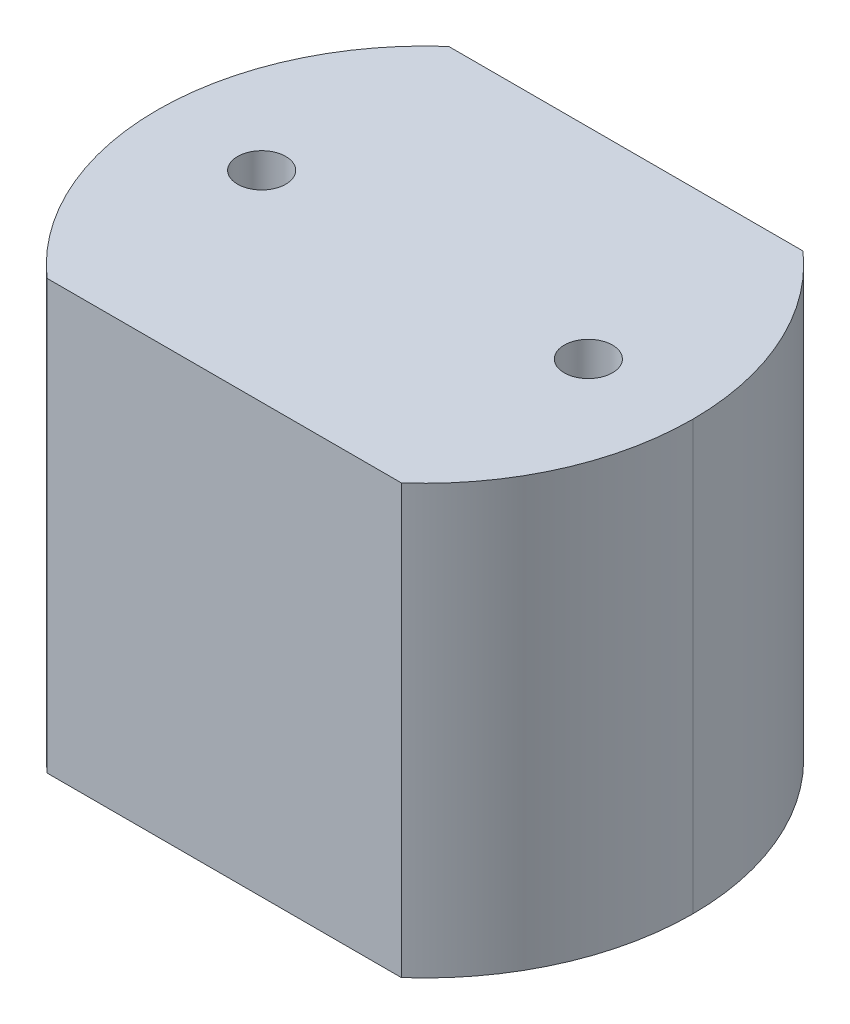
ISO-10303-21;
HEADER;
FILE_DESCRIPTION(('STEP AP214'),'2;1');
FILE_NAME('part.step','',(''),(''),'','','');
FILE_SCHEMA(('AUTOMOTIVE_DESIGN { 1 0 10303 214 1 1 1 1 }'));
ENDSEC;
DATA;
#1=APPLICATION_CONTEXT('core data for automotive mechanical design processes');
#2=APPLICATION_PROTOCOL_DEFINITION('international standard','automotive_design',2000,#1);
#3=PRODUCT_CONTEXT('',#1,'mechanical');
#4=PRODUCT('Part','Part','',(#3));
#5=PRODUCT_RELATED_PRODUCT_CATEGORY('part','',(#4));
#6=PRODUCT_DEFINITION_FORMATION('','',#4);
#7=PRODUCT_DEFINITION_CONTEXT('part definition',#1,'design');
#8=PRODUCT_DEFINITION('design','',#6,#7);
#9=PRODUCT_DEFINITION_SHAPE('','',#8);
#10=(LENGTH_UNIT() NAMED_UNIT(*) SI_UNIT(.MILLI.,.METRE.));
#11=(NAMED_UNIT(*) PLANE_ANGLE_UNIT() SI_UNIT($,.RADIAN.));
#12=(NAMED_UNIT(*) SI_UNIT($,.STERADIAN.) SOLID_ANGLE_UNIT());
#13=UNCERTAINTY_MEASURE_WITH_UNIT(LENGTH_MEASURE(1.E-05),#10,'distance_accuracy_value','');
#14=(GEOMETRIC_REPRESENTATION_CONTEXT(3) GLOBAL_UNCERTAINTY_ASSIGNED_CONTEXT((#13)) GLOBAL_UNIT_ASSIGNED_CONTEXT((#10,
#11,#12)) REPRESENTATION_CONTEXT('',''));
#15=CARTESIAN_POINT('',(0.,0.,0.));
#16=DIRECTION('',(0.,0.,1.));
#17=DIRECTION('',(1.,0.,0.));
#18=AXIS2_PLACEMENT_3D('',#15,#16,#17);
#19=CARTESIAN_POINT('',(0.,20.32,0.));
#20=DIRECTION('',(0.,-1.,0.));
#21=DIRECTION('',(0.,0.,-1.));
#22=AXIS2_PLACEMENT_3D('',#19,#20,#21);
#23=PLANE('',#22);
#24=CARTESIAN_POINT('',(7.747,20.32,0.));
#25=DIRECTION('',(0.,1.,0.));
#26=DIRECTION('',(0.,0.,-1.));
#27=AXIS2_PLACEMENT_3D('',#24,#25,#26);
#28=CIRCLE('',#27,1.143);
#29=CARTESIAN_POINT('',(7.747,20.32,-1.143));
#30=VERTEX_POINT('',#29);
#31=EDGE_CURVE('E129',#30,#30,#28,.T.);
#32=ORIENTED_EDGE('',*,*,#31,.F.);
#33=EDGE_LOOP('',(#32));
#34=FACE_BOUND('',#33,.T.);
#35=CARTESIAN_POINT('',(-7.747,20.32,0.));
#36=DIRECTION('',(0.,1.,0.));
#37=DIRECTION('',(0.,0.,1.));
#38=AXIS2_PLACEMENT_3D('',#35,#36,#37);
#39=CIRCLE('',#38,1.143);
#40=CARTESIAN_POINT('',(-7.747,20.32,1.143));
#41=VERTEX_POINT('',#40);
#42=EDGE_CURVE('E143',#41,#41,#39,.T.);
#43=ORIENTED_EDGE('',*,*,#42,.F.);
#44=EDGE_LOOP('',(#43));
#45=FACE_BOUND('',#44,.T.);
#46=CARTESIAN_POINT('',(0.,20.32,0.));
#47=DIRECTION('',(0.,-1.,0.));
#48=DIRECTION('',(0.,0.,-1.));
#49=AXIS2_PLACEMENT_3D('',#46,#47,#48);
#50=CIRCLE('',#49,12.7);
#51=CARTESIAN_POINT('',(-12.7,20.32,0.));
#52=VERTEX_POINT('',#51);
#53=CARTESIAN_POINT('',(-8.40026041263007,20.32,9.525));
#54=VERTEX_POINT('',#53);
#55=EDGE_CURVE('E116',#52,#54,#50,.F.);
#56=ORIENTED_EDGE('',*,*,#55,.T.);
#57=DIRECTION('',(-1.,0.,0.));
#58=VECTOR('',#57,1.);
#59=CARTESIAN_POINT('',(8.40026041263007,20.32,9.525));
#60=LINE('',#59,#58);
#61=CARTESIAN_POINT('',(8.40026041263007,20.32,9.525));
#62=VERTEX_POINT('',#61);
#63=EDGE_CURVE('E50',#62,#54,#60,.T.);
#64=ORIENTED_EDGE('',*,*,#63,.F.);
#65=CARTESIAN_POINT('',(0.,20.32,0.));
#66=DIRECTION('',(0.,-1.,0.));
#67=DIRECTION('',(0.,0.,-1.));
#68=AXIS2_PLACEMENT_3D('',#65,#66,#67);
#69=CIRCLE('',#68,12.7);
#70=CARTESIAN_POINT('',(12.7,20.32,0.));
#71=VERTEX_POINT('',#70);
#72=EDGE_CURVE('E100',#62,#71,#69,.F.);
#73=ORIENTED_EDGE('',*,*,#72,.T.);
#74=CARTESIAN_POINT('',(0.,20.32,0.));
#75=DIRECTION('',(0.,-1.,0.));
#76=DIRECTION('',(0.,0.,-1.));
#77=AXIS2_PLACEMENT_3D('',#74,#75,#76);
#78=CIRCLE('',#77,12.7);
#79=CARTESIAN_POINT('',(8.40026041263007,20.32,-9.525));
#80=VERTEX_POINT('',#79);
#81=EDGE_CURVE('E42',#71,#80,#78,.F.);
#82=ORIENTED_EDGE('',*,*,#81,.T.);
#83=DIRECTION('',(1.,0.,0.));
#84=VECTOR('',#83,1.);
#85=CARTESIAN_POINT('',(8.40026041263007,20.32,-9.525));
#86=LINE('',#85,#84);
#87=CARTESIAN_POINT('',(-8.40026041263007,20.32,-9.525));
#88=VERTEX_POINT('',#87);
#89=EDGE_CURVE('E137',#88,#80,#86,.T.);
#90=ORIENTED_EDGE('',*,*,#89,.F.);
#91=CARTESIAN_POINT('',(0.,20.32,0.));
#92=DIRECTION('',(0.,-1.,0.));
#93=DIRECTION('',(0.,0.,-1.));
#94=AXIS2_PLACEMENT_3D('',#91,#92,#93);
#95=CIRCLE('',#94,12.7);
#96=EDGE_CURVE('E11',#88,#52,#95,.F.);
#97=ORIENTED_EDGE('',*,*,#96,.T.);
#98=EDGE_LOOP('',(#56,#64,#73,#82,#90,#97));
#99=FACE_BOUND('',#98,.T.);
#100=ADVANCED_FACE('F33',(#34,#45,#99),#23,.F.);
#101=CARTESIAN_POINT('',(0.,0.,0.));
#102=DIRECTION('',(0.,-1.,0.));
#103=DIRECTION('',(0.,0.,-1.));
#104=AXIS2_PLACEMENT_3D('',#101,#102,#103);
#105=PLANE('',#104);
#106=DIRECTION('',(-1.,0.,0.));
#107=VECTOR('',#106,1.);
#108=CARTESIAN_POINT('',(8.40026041263007,0.,9.525));
#109=LINE('',#108,#107);
#110=CARTESIAN_POINT('',(8.40026041263007,0.,9.525));
#111=VERTEX_POINT('',#110);
#112=CARTESIAN_POINT('',(-8.40026041263007,0.,9.525));
#113=VERTEX_POINT('',#112);
#114=EDGE_CURVE('E85',#111,#113,#109,.T.);
#115=ORIENTED_EDGE('',*,*,#114,.T.);
#116=CARTESIAN_POINT('',(0.,0.,0.));
#117=DIRECTION('',(0.,-1.,0.));
#118=DIRECTION('',(0.,0.,-1.));
#119=AXIS2_PLACEMENT_3D('',#116,#117,#118);
#120=CIRCLE('',#119,12.7);
#121=CARTESIAN_POINT('',(-12.7,0.,0.));
#122=VERTEX_POINT('',#121);
#123=EDGE_CURVE('E106',#113,#122,#120,.T.);
#124=ORIENTED_EDGE('',*,*,#123,.T.);
#125=CARTESIAN_POINT('',(0.,0.,0.));
#126=DIRECTION('',(0.,-1.,0.));
#127=DIRECTION('',(0.,0.,-1.));
#128=AXIS2_PLACEMENT_3D('',#125,#126,#127);
#129=CIRCLE('',#128,12.7);
#130=CARTESIAN_POINT('',(-8.40026041263007,0.,-9.525));
#131=VERTEX_POINT('',#130);
#132=EDGE_CURVE('E108',#122,#131,#129,.T.);
#133=ORIENTED_EDGE('',*,*,#132,.T.);
#134=DIRECTION('',(1.,0.,0.));
#135=VECTOR('',#134,1.);
#136=CARTESIAN_POINT('',(8.40026041263007,0.,-9.525));
#137=LINE('',#136,#135);
#138=CARTESIAN_POINT('',(8.40026041263007,0.,-9.525));
#139=VERTEX_POINT('',#138);
#140=EDGE_CURVE('E58',#131,#139,#137,.T.);
#141=ORIENTED_EDGE('',*,*,#140,.T.);
#142=CARTESIAN_POINT('',(0.,0.,0.));
#143=DIRECTION('',(0.,-1.,0.));
#144=DIRECTION('',(0.,0.,-1.));
#145=AXIS2_PLACEMENT_3D('',#142,#143,#144);
#146=CIRCLE('',#145,12.7);
#147=CARTESIAN_POINT('',(12.7,0.,0.));
#148=VERTEX_POINT('',#147);
#149=EDGE_CURVE('E105',#139,#148,#146,.T.);
#150=ORIENTED_EDGE('',*,*,#149,.T.);
#151=CARTESIAN_POINT('',(0.,0.,0.));
#152=DIRECTION('',(0.,-1.,0.));
#153=DIRECTION('',(0.,0.,-1.));
#154=AXIS2_PLACEMENT_3D('',#151,#152,#153);
#155=CIRCLE('',#154,12.7);
#156=EDGE_CURVE('E98',#148,#111,#155,.T.);
#157=ORIENTED_EDGE('',*,*,#156,.T.);
#158=EDGE_LOOP('',(#115,#124,#133,#141,#150,#157));
#159=FACE_BOUND('',#158,.T.);
#160=CARTESIAN_POINT('',(7.747,0.,0.));
#161=DIRECTION('',(0.,1.,0.));
#162=DIRECTION('',(0.,0.,-1.));
#163=AXIS2_PLACEMENT_3D('',#160,#161,#162);
#164=CIRCLE('',#163,1.143);
#165=CARTESIAN_POINT('',(7.747,0.,-1.143));
#166=VERTEX_POINT('',#165);
#167=EDGE_CURVE('E140',#166,#166,#164,.T.);
#168=ORIENTED_EDGE('',*,*,#167,.T.);
#169=EDGE_LOOP('',(#168));
#170=FACE_BOUND('',#169,.T.);
#171=CARTESIAN_POINT('',(-7.747,0.,0.));
#172=DIRECTION('',(0.,1.,0.));
#173=DIRECTION('',(0.,0.,1.));
#174=AXIS2_PLACEMENT_3D('',#171,#172,#173);
#175=CIRCLE('',#174,1.143);
#176=CARTESIAN_POINT('',(-7.747,0.,1.143));
#177=VERTEX_POINT('',#176);
#178=EDGE_CURVE('E110',#177,#177,#175,.T.);
#179=ORIENTED_EDGE('',*,*,#178,.T.);
#180=EDGE_LOOP('',(#179));
#181=FACE_BOUND('',#180,.T.);
#182=ADVANCED_FACE('F102',(#159,#170,#181),#105,.T.);
#183=CARTESIAN_POINT('',(-7.747,0.,0.));
#184=DIRECTION('',(0.,1.,0.));
#185=DIRECTION('',(0.,0.,1.));
#186=AXIS2_PLACEMENT_3D('',#183,#184,#185);
#187=CYLINDRICAL_SURFACE('',#186,1.143);
#188=ORIENTED_EDGE('',*,*,#178,.F.);
#189=EDGE_LOOP('',(#188));
#190=FACE_BOUND('',#189,.T.);
#191=ORIENTED_EDGE('',*,*,#42,.T.);
#192=EDGE_LOOP('',(#191));
#193=FACE_BOUND('',#192,.T.);
#194=ADVANCED_FACE('F150',(#190,#193),#187,.F.);
#195=CARTESIAN_POINT('',(7.747,0.,0.));
#196=DIRECTION('',(0.,1.,0.));
#197=DIRECTION('',(0.,0.,1.));
#198=AXIS2_PLACEMENT_3D('',#195,#196,#197);
#199=CYLINDRICAL_SURFACE('',#198,1.143);
#200=ORIENTED_EDGE('',*,*,#167,.F.);
#201=EDGE_LOOP('',(#200));
#202=FACE_BOUND('',#201,.T.);
#203=ORIENTED_EDGE('',*,*,#31,.T.);
#204=EDGE_LOOP('',(#203));
#205=FACE_BOUND('',#204,.T.);
#206=ADVANCED_FACE('F174',(#202,#205),#199,.F.);
#207=CARTESIAN_POINT('',(0.,20.32,0.));
#208=DIRECTION('',(0.,-1.,0.));
#209=DIRECTION('',(0.,0.,-1.));
#210=AXIS2_PLACEMENT_3D('',#207,#208,#209);
#211=CYLINDRICAL_SURFACE('',#210,12.7);
#212=DIRECTION('',(0.,1.,0.));
#213=VECTOR('',#212,1.);
#214=CARTESIAN_POINT('',(8.40026041263007,0.,9.525));
#215=LINE('',#214,#213);
#216=EDGE_CURVE('E88',#111,#62,#215,.T.);
#217=ORIENTED_EDGE('',*,*,#216,.F.);
#218=ORIENTED_EDGE('',*,*,#156,.F.);
#219=DIRECTION('',(0.,-1.,0.));
#220=VECTOR('',#219,1.);
#221=CARTESIAN_POINT('',(12.7,20.32,0.));
#222=LINE('',#221,#220);
#223=EDGE_CURVE('E37',#71,#148,#222,.T.);
#224=ORIENTED_EDGE('',*,*,#223,.F.);
#225=ORIENTED_EDGE('',*,*,#72,.F.);
#226=EDGE_LOOP('',(#217,#218,#224,#225));
#227=FACE_BOUND('',#226,.T.);
#228=ADVANCED_FACE('F35',(#227),#211,.T.);
#229=CARTESIAN_POINT('',(0.,20.32,0.));
#230=DIRECTION('',(0.,-1.,0.));
#231=DIRECTION('',(0.,0.,-1.));
#232=AXIS2_PLACEMENT_3D('',#229,#230,#231);
#233=CYLINDRICAL_SURFACE('',#232,12.7);
#234=DIRECTION('',(0.,1.,0.));
#235=VECTOR('',#234,1.);
#236=CARTESIAN_POINT('',(8.40026041263007,0.,-9.525));
#237=LINE('',#236,#235);
#238=EDGE_CURVE('E123',#139,#80,#237,.T.);
#239=ORIENTED_EDGE('',*,*,#238,.T.);
#240=ORIENTED_EDGE('',*,*,#81,.F.);
#241=ORIENTED_EDGE('',*,*,#223,.T.);
#242=ORIENTED_EDGE('',*,*,#149,.F.);
#243=EDGE_LOOP('',(#239,#240,#241,#242));
#244=FACE_BOUND('',#243,.T.);
#245=ADVANCED_FACE('F161',(#244),#233,.T.);
#246=CARTESIAN_POINT('',(0.,20.32,0.));
#247=DIRECTION('',(0.,-1.,0.));
#248=DIRECTION('',(0.,0.,-1.));
#249=AXIS2_PLACEMENT_3D('',#246,#247,#248);
#250=CYLINDRICAL_SURFACE('',#249,12.7);
#251=DIRECTION('',(0.,1.,0.));
#252=VECTOR('',#251,1.);
#253=CARTESIAN_POINT('',(-8.40026041263007,0.,9.525));
#254=LINE('',#253,#252);
#255=EDGE_CURVE('E89',#113,#54,#254,.T.);
#256=ORIENTED_EDGE('',*,*,#255,.T.);
#257=ORIENTED_EDGE('',*,*,#55,.F.);
#258=DIRECTION('',(0.,-1.,0.));
#259=VECTOR('',#258,1.);
#260=CARTESIAN_POINT('',(-12.7,20.32,0.));
#261=LINE('',#260,#259);
#262=EDGE_CURVE('E121',#122,#52,#261,.F.);
#263=ORIENTED_EDGE('',*,*,#262,.F.);
#264=ORIENTED_EDGE('',*,*,#123,.F.);
#265=EDGE_LOOP('',(#256,#257,#263,#264));
#266=FACE_BOUND('',#265,.T.);
#267=ADVANCED_FACE('F158',(#266),#250,.T.);
#268=CARTESIAN_POINT('',(0.,20.32,0.));
#269=DIRECTION('',(0.,-1.,0.));
#270=DIRECTION('',(0.,0.,-1.));
#271=AXIS2_PLACEMENT_3D('',#268,#269,#270);
#272=CYLINDRICAL_SURFACE('',#271,12.7);
#273=DIRECTION('',(0.,1.,0.));
#274=VECTOR('',#273,1.);
#275=CARTESIAN_POINT('',(-8.40026041263007,0.,-9.525));
#276=LINE('',#275,#274);
#277=EDGE_CURVE('E131',#131,#88,#276,.T.);
#278=ORIENTED_EDGE('',*,*,#277,.F.);
#279=ORIENTED_EDGE('',*,*,#132,.F.);
#280=ORIENTED_EDGE('',*,*,#262,.T.);
#281=ORIENTED_EDGE('',*,*,#96,.F.);
#282=EDGE_LOOP('',(#278,#279,#280,#281));
#283=FACE_BOUND('',#282,.T.);
#284=ADVANCED_FACE('F162',(#283),#272,.T.);
#285=CARTESIAN_POINT('',(8.40026041263007,0.,-9.525));
#286=DIRECTION('',(0.,0.,1.));
#287=DIRECTION('',(1.,0.,0.));
#288=AXIS2_PLACEMENT_3D('',#285,#286,#287);
#289=PLANE('',#288);
#290=ORIENTED_EDGE('',*,*,#89,.T.);
#291=ORIENTED_EDGE('',*,*,#238,.F.);
#292=ORIENTED_EDGE('',*,*,#140,.F.);
#293=ORIENTED_EDGE('',*,*,#277,.T.);
#294=EDGE_LOOP('',(#290,#291,#292,#293));
#295=FACE_BOUND('',#294,.T.);
#296=ADVANCED_FACE('F163',(#295),#289,.F.);
#297=CARTESIAN_POINT('',(8.40026041263007,0.,9.525));
#298=DIRECTION('',(0.,0.,-1.));
#299=DIRECTION('',(-1.,0.,0.));
#300=AXIS2_PLACEMENT_3D('',#297,#298,#299);
#301=PLANE('',#300);
#302=ORIENTED_EDGE('',*,*,#63,.T.);
#303=ORIENTED_EDGE('',*,*,#255,.F.);
#304=ORIENTED_EDGE('',*,*,#114,.F.);
#305=ORIENTED_EDGE('',*,*,#216,.T.);
#306=EDGE_LOOP('',(#302,#303,#304,#305));
#307=FACE_BOUND('',#306,.T.);
#308=ADVANCED_FACE('F87',(#307),#301,.F.);
#309=CLOSED_SHELL('',(#100,#182,#194,#206,#228,#245,#267,#284,#296,#308));
#310=MANIFOLD_SOLID_BREP('B2',#309);
#311=ADVANCED_BREP_SHAPE_REPRESENTATION('',(#18,#310),#14);
#312=SHAPE_DEFINITION_REPRESENTATION(#9,#311);
ENDSEC;
END-ISO-10303-21;
